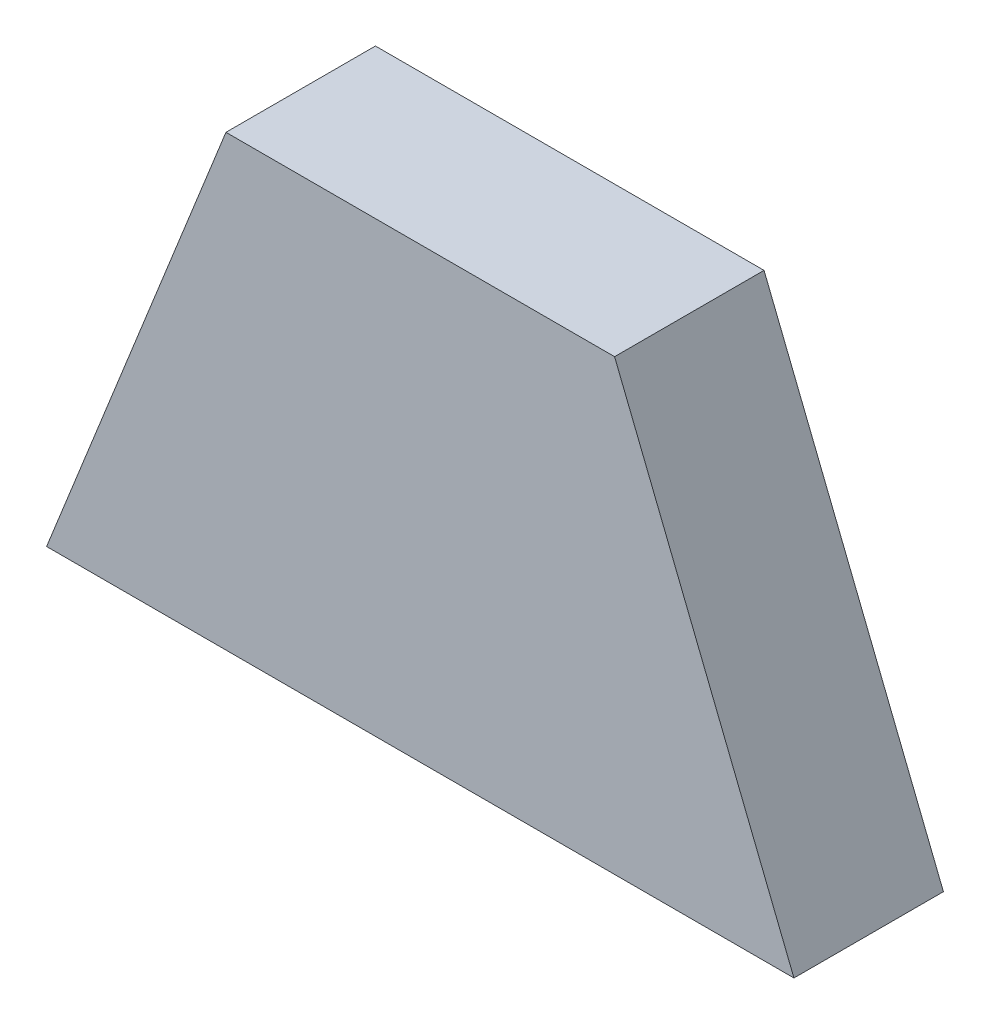
ISO-10303-21;
HEADER;
FILE_DESCRIPTION(('STEP AP214'),'2;1');
FILE_NAME('part.step','',(''),(''),'','','');
FILE_SCHEMA(('AUTOMOTIVE_DESIGN { 1 0 10303 214 1 1 1 1 }'));
ENDSEC;
DATA;
#1=APPLICATION_CONTEXT('core data for automotive mechanical design processes');
#2=APPLICATION_PROTOCOL_DEFINITION('international standard','automotive_design',2000,#1);
#3=PRODUCT_CONTEXT('',#1,'mechanical');
#4=PRODUCT('Part','Part','',(#3));
#5=PRODUCT_RELATED_PRODUCT_CATEGORY('part','',(#4));
#6=PRODUCT_DEFINITION_FORMATION('','',#4);
#7=PRODUCT_DEFINITION_CONTEXT('part definition',#1,'design');
#8=PRODUCT_DEFINITION('design','',#6,#7);
#9=PRODUCT_DEFINITION_SHAPE('','',#8);
#10=(LENGTH_UNIT() NAMED_UNIT(*) SI_UNIT(.MILLI.,.METRE.));
#11=(NAMED_UNIT(*) PLANE_ANGLE_UNIT() SI_UNIT($,.RADIAN.));
#12=(NAMED_UNIT(*) SI_UNIT($,.STERADIAN.) SOLID_ANGLE_UNIT());
#13=UNCERTAINTY_MEASURE_WITH_UNIT(LENGTH_MEASURE(1.E-05),#10,'distance_accuracy_value','');
#14=(GEOMETRIC_REPRESENTATION_CONTEXT(3) GLOBAL_UNCERTAINTY_ASSIGNED_CONTEXT((#13)) GLOBAL_UNIT_ASSIGNED_CONTEXT((#10,
#11,#12)) REPRESENTATION_CONTEXT('',''));
#15=CARTESIAN_POINT('',(0.,0.,0.));
#16=DIRECTION('',(0.,0.,1.));
#17=DIRECTION('',(1.,0.,0.));
#18=AXIS2_PLACEMENT_3D('',#15,#16,#17);
#19=CARTESIAN_POINT('',(12.,30.,-10.));
#20=DIRECTION('',(-0.928476690885259,0.371390676354104,0.));
#21=DIRECTION('',(-0.371390676354104,-0.928476690885259,0.));
#22=AXIS2_PLACEMENT_3D('',#19,#20,#21);
#23=PLANE('',#22);
#24=DIRECTION('',(-0.371390676354104,-0.928476690885259,0.));
#25=VECTOR('',#24,1.);
#26=CARTESIAN_POINT('',(12.,30.,0.));
#27=LINE('',#26,#25);
#28=CARTESIAN_POINT('',(12.,30.,0.));
#29=VERTEX_POINT('',#28);
#30=CARTESIAN_POINT('',(0.,0.,0.));
#31=VERTEX_POINT('',#30);
#32=EDGE_CURVE('E95',#29,#31,#27,.T.);
#33=ORIENTED_EDGE('',*,*,#32,.F.);
#34=DIRECTION('',(0.,0.,1.));
#35=VECTOR('',#34,1.);
#36=CARTESIAN_POINT('',(12.,30.,-10.));
#37=LINE('',#36,#35);
#38=CARTESIAN_POINT('',(12.,30.,-10.));
#39=VERTEX_POINT('',#38);
#40=EDGE_CURVE('E11',#39,#29,#37,.T.);
#41=ORIENTED_EDGE('',*,*,#40,.F.);
#42=DIRECTION('',(-0.371390676354104,-0.928476690885259,0.));
#43=VECTOR('',#42,1.);
#44=CARTESIAN_POINT('',(12.,30.,-10.));
#45=LINE('',#44,#43);
#46=CARTESIAN_POINT('',(0.,0.,-10.));
#47=VERTEX_POINT('',#46);
#48=EDGE_CURVE('E89',#39,#47,#45,.T.);
#49=ORIENTED_EDGE('',*,*,#48,.T.);
#50=DIRECTION('',(0.,0.,1.));
#51=VECTOR('',#50,1.);
#52=CARTESIAN_POINT('',(0.,0.,-10.));
#53=LINE('',#52,#51);
#54=EDGE_CURVE('E34',#47,#31,#53,.T.);
#55=ORIENTED_EDGE('',*,*,#54,.T.);
#56=EDGE_LOOP('',(#33,#41,#49,#55));
#57=FACE_BOUND('',#56,.T.);
#58=ADVANCED_FACE('F31',(#57),#23,.T.);
#59=CARTESIAN_POINT('',(38.,30.,-10.));
#60=DIRECTION('',(0.,1.,0.));
#61=DIRECTION('',(0.,0.,1.));
#62=AXIS2_PLACEMENT_3D('',#59,#60,#61);
#63=PLANE('',#62);
#64=DIRECTION('',(-1.,0.,0.));
#65=VECTOR('',#64,1.);
#66=CARTESIAN_POINT('',(38.,30.,0.));
#67=LINE('',#66,#65);
#68=CARTESIAN_POINT('',(38.,30.,0.));
#69=VERTEX_POINT('',#68);
#70=EDGE_CURVE('E91',#69,#29,#67,.T.);
#71=ORIENTED_EDGE('',*,*,#70,.F.);
#72=DIRECTION('',(0.,0.,1.));
#73=VECTOR('',#72,1.);
#74=CARTESIAN_POINT('',(38.,30.,-10.));
#75=LINE('',#74,#73);
#76=CARTESIAN_POINT('',(38.,30.,-10.));
#77=VERTEX_POINT('',#76);
#78=EDGE_CURVE('E40',#77,#69,#75,.T.);
#79=ORIENTED_EDGE('',*,*,#78,.F.);
#80=DIRECTION('',(-1.,0.,0.));
#81=VECTOR('',#80,1.);
#82=CARTESIAN_POINT('',(38.,30.,-10.));
#83=LINE('',#82,#81);
#84=EDGE_CURVE('E86',#77,#39,#83,.T.);
#85=ORIENTED_EDGE('',*,*,#84,.T.);
#86=ORIENTED_EDGE('',*,*,#40,.T.);
#87=EDGE_LOOP('',(#71,#79,#85,#86));
#88=FACE_BOUND('',#87,.T.);
#89=ADVANCED_FACE('F105',(#88),#63,.T.);
#90=CARTESIAN_POINT('',(50.,0.,-10.));
#91=DIRECTION('',(0.928476690885259,0.371390676354104,0.));
#92=DIRECTION('',(-0.371390676354104,0.928476690885259,0.));
#93=AXIS2_PLACEMENT_3D('',#90,#91,#92);
#94=PLANE('',#93);
#95=DIRECTION('',(-0.371390676354104,0.928476690885259,0.));
#96=VECTOR('',#95,1.);
#97=CARTESIAN_POINT('',(50.,0.,0.));
#98=LINE('',#97,#96);
#99=CARTESIAN_POINT('',(50.,0.,0.));
#100=VERTEX_POINT('',#99);
#101=EDGE_CURVE('E81',#100,#69,#98,.T.);
#102=ORIENTED_EDGE('',*,*,#101,.F.);
#103=DIRECTION('',(0.,0.,1.));
#104=VECTOR('',#103,1.);
#105=CARTESIAN_POINT('',(50.,0.,-10.));
#106=LINE('',#105,#104);
#107=CARTESIAN_POINT('',(50.,0.,-10.));
#108=VERTEX_POINT('',#107);
#109=EDGE_CURVE('E76',#108,#100,#106,.T.);
#110=ORIENTED_EDGE('',*,*,#109,.F.);
#111=DIRECTION('',(-0.371390676354104,0.928476690885259,0.));
#112=VECTOR('',#111,1.);
#113=CARTESIAN_POINT('',(50.,0.,-10.));
#114=LINE('',#113,#112);
#115=EDGE_CURVE('E79',#108,#77,#114,.T.);
#116=ORIENTED_EDGE('',*,*,#115,.T.);
#117=ORIENTED_EDGE('',*,*,#78,.T.);
#118=EDGE_LOOP('',(#102,#110,#116,#117));
#119=FACE_BOUND('',#118,.T.);
#120=ADVANCED_FACE('F78',(#119),#94,.T.);
#121=CARTESIAN_POINT('',(0.,0.,-10.));
#122=DIRECTION('',(0.,-1.,0.));
#123=DIRECTION('',(0.,0.,-1.));
#124=AXIS2_PLACEMENT_3D('',#121,#122,#123);
#125=PLANE('',#124);
#126=DIRECTION('',(1.,0.,0.));
#127=VECTOR('',#126,1.);
#128=CARTESIAN_POINT('',(0.,0.,0.));
#129=LINE('',#128,#127);
#130=EDGE_CURVE('E98',#31,#100,#129,.T.);
#131=ORIENTED_EDGE('',*,*,#130,.F.);
#132=ORIENTED_EDGE('',*,*,#54,.F.);
#133=DIRECTION('',(1.,0.,0.));
#134=VECTOR('',#133,1.);
#135=CARTESIAN_POINT('',(0.,0.,-10.));
#136=LINE('',#135,#134);
#137=EDGE_CURVE('E85',#47,#108,#136,.T.);
#138=ORIENTED_EDGE('',*,*,#137,.T.);
#139=ORIENTED_EDGE('',*,*,#109,.T.);
#140=EDGE_LOOP('',(#131,#132,#138,#139));
#141=FACE_BOUND('',#140,.T.);
#142=ADVANCED_FACE('F88',(#141),#125,.T.);
#143=CARTESIAN_POINT('',(0.,0.,-10.));
#144=DIRECTION('',(0.,0.,1.));
#145=DIRECTION('',(1.,0.,0.));
#146=AXIS2_PLACEMENT_3D('',#143,#144,#145);
#147=PLANE('',#146);
#148=ORIENTED_EDGE('',*,*,#48,.F.);
#149=ORIENTED_EDGE('',*,*,#84,.F.);
#150=ORIENTED_EDGE('',*,*,#115,.F.);
#151=ORIENTED_EDGE('',*,*,#137,.F.);
#152=EDGE_LOOP('',(#148,#149,#150,#151));
#153=FACE_BOUND('',#152,.T.);
#154=ADVANCED_FACE('F84',(#153),#147,.F.);
#155=CARTESIAN_POINT('',(0.,0.,0.));
#156=DIRECTION('',(0.,0.,1.));
#157=DIRECTION('',(1.,0.,0.));
#158=AXIS2_PLACEMENT_3D('',#155,#156,#157);
#159=PLANE('',#158);
#160=ORIENTED_EDGE('',*,*,#32,.T.);
#161=ORIENTED_EDGE('',*,*,#130,.T.);
#162=ORIENTED_EDGE('',*,*,#101,.T.);
#163=ORIENTED_EDGE('',*,*,#70,.T.);
#164=EDGE_LOOP('',(#160,#161,#162,#163));
#165=FACE_BOUND('',#164,.T.);
#166=ADVANCED_FACE('F104',(#165),#159,.T.);
#167=CLOSED_SHELL('',(#58,#89,#120,#142,#154,#166));
#168=MANIFOLD_SOLID_BREP('B2',#167);
#169=ADVANCED_BREP_SHAPE_REPRESENTATION('',(#18,#168),#14);
#170=SHAPE_DEFINITION_REPRESENTATION(#9,#169);
ENDSEC;
END-ISO-10303-21;
